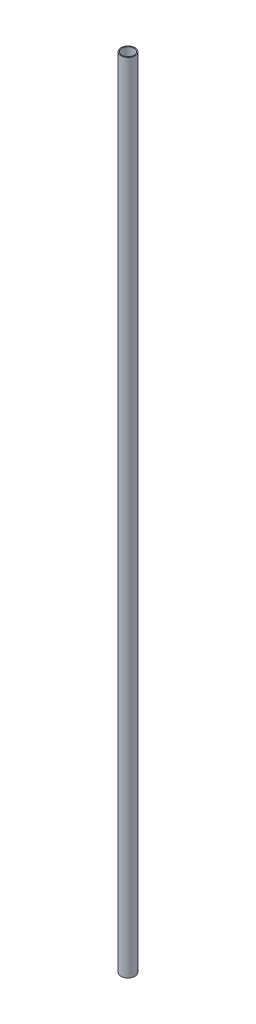
ISO-10303-21;
HEADER;
FILE_DESCRIPTION(('STEP AP214'),'2;1');
FILE_NAME('part.step','',(''),(''),'','','');
FILE_SCHEMA(('AUTOMOTIVE_DESIGN { 1 0 10303 214 1 1 1 1 }'));
ENDSEC;
DATA;
#1=APPLICATION_CONTEXT('core data for automotive mechanical design processes');
#2=APPLICATION_PROTOCOL_DEFINITION('international standard','automotive_design',2000,#1);
#3=PRODUCT_CONTEXT('',#1,'mechanical');
#4=PRODUCT('Part','Part','',(#3));
#5=PRODUCT_RELATED_PRODUCT_CATEGORY('part','',(#4));
#6=PRODUCT_DEFINITION_FORMATION('','',#4);
#7=PRODUCT_DEFINITION_CONTEXT('part definition',#1,'design');
#8=PRODUCT_DEFINITION('design','',#6,#7);
#9=PRODUCT_DEFINITION_SHAPE('','',#8);
#10=(LENGTH_UNIT() NAMED_UNIT(*) SI_UNIT(.MILLI.,.METRE.));
#11=(NAMED_UNIT(*) PLANE_ANGLE_UNIT() SI_UNIT($,.RADIAN.));
#12=(NAMED_UNIT(*) SI_UNIT($,.STERADIAN.) SOLID_ANGLE_UNIT());
#13=UNCERTAINTY_MEASURE_WITH_UNIT(LENGTH_MEASURE(1.E-05),#10,'distance_accuracy_value','');
#14=(GEOMETRIC_REPRESENTATION_CONTEXT(3) GLOBAL_UNCERTAINTY_ASSIGNED_CONTEXT((#13)) GLOBAL_UNIT_ASSIGNED_CONTEXT((#10,
#11,#12)) REPRESENTATION_CONTEXT('',''));
#15=CARTESIAN_POINT('',(0.,0.,0.));
#16=DIRECTION('',(0.,0.,1.));
#17=DIRECTION('',(1.,0.,0.));
#18=AXIS2_PLACEMENT_3D('',#15,#16,#17);
#19=CARTESIAN_POINT('',(0.,913.,0.));
#20=DIRECTION('',(0.,-1.,0.));
#21=DIRECTION('',(0.,0.,-1.));
#22=AXIS2_PLACEMENT_3D('',#19,#20,#21);
#23=CYLINDRICAL_SURFACE('',#22,7.);
#24=CARTESIAN_POINT('',(0.,913.,0.));
#25=DIRECTION('',(0.,1.,0.));
#26=DIRECTION('',(0.,0.,1.));
#27=AXIS2_PLACEMENT_3D('',#24,#25,#26);
#28=CIRCLE('',#27,7.);
#29=CARTESIAN_POINT('',(0.,913.,7.));
#30=VERTEX_POINT('',#29);
#31=EDGE_CURVE('E56',#30,#30,#28,.T.);
#32=ORIENTED_EDGE('',*,*,#31,.T.);
#33=EDGE_LOOP('',(#32));
#34=FACE_BOUND('',#33,.T.);
#35=CARTESIAN_POINT('',(0.,0.,0.));
#36=DIRECTION('',(0.,1.,0.));
#37=DIRECTION('',(0.,0.,1.));
#38=AXIS2_PLACEMENT_3D('',#35,#36,#37);
#39=CIRCLE('',#38,7.);
#40=CARTESIAN_POINT('',(0.,0.,7.));
#41=VERTEX_POINT('',#40);
#42=EDGE_CURVE('E62',#41,#41,#39,.T.);
#43=ORIENTED_EDGE('',*,*,#42,.F.);
#44=EDGE_LOOP('',(#43));
#45=FACE_BOUND('',#44,.T.);
#46=ADVANCED_FACE('F49',(#34,#45),#23,.F.);
#47=CARTESIAN_POINT('',(0.,913.,0.));
#48=DIRECTION('',(0.,-1.,0.));
#49=DIRECTION('',(0.,0.,-1.));
#50=AXIS2_PLACEMENT_3D('',#47,#48,#49);
#51=CYLINDRICAL_SURFACE('',#50,8.);
#52=CARTESIAN_POINT('',(0.,913.,0.));
#53=DIRECTION('',(0.,1.,0.));
#54=DIRECTION('',(0.,0.,1.));
#55=AXIS2_PLACEMENT_3D('',#52,#53,#54);
#56=CIRCLE('',#55,8.);
#57=CARTESIAN_POINT('',(0.,913.,8.));
#58=VERTEX_POINT('',#57);
#59=EDGE_CURVE('E10',#58,#58,#56,.T.);
#60=ORIENTED_EDGE('',*,*,#59,.F.);
#61=EDGE_LOOP('',(#60));
#62=FACE_BOUND('',#61,.T.);
#63=CARTESIAN_POINT('',(0.,0.,0.));
#64=DIRECTION('',(0.,1.,0.));
#65=DIRECTION('',(0.,0.,1.));
#66=AXIS2_PLACEMENT_3D('',#63,#64,#65);
#67=CIRCLE('',#66,8.);
#68=CARTESIAN_POINT('',(0.,0.,8.));
#69=VERTEX_POINT('',#68);
#70=EDGE_CURVE('E52',#69,#69,#67,.T.);
#71=ORIENTED_EDGE('',*,*,#70,.T.);
#72=EDGE_LOOP('',(#71));
#73=FACE_BOUND('',#72,.T.);
#74=ADVANCED_FACE('F69',(#62,#73),#51,.T.);
#75=CARTESIAN_POINT('',(0.,913.,0.));
#76=DIRECTION('',(0.,1.,0.));
#77=DIRECTION('',(0.,0.,1.));
#78=AXIS2_PLACEMENT_3D('',#75,#76,#77);
#79=PLANE('',#78);
#80=ORIENTED_EDGE('',*,*,#31,.F.);
#81=EDGE_LOOP('',(#80));
#82=FACE_BOUND('',#81,.T.);
#83=ORIENTED_EDGE('',*,*,#59,.T.);
#84=EDGE_LOOP('',(#83));
#85=FACE_BOUND('',#84,.T.);
#86=ADVANCED_FACE('F73',(#82,#85),#79,.T.);
#87=CARTESIAN_POINT('',(0.,0.,0.));
#88=DIRECTION('',(0.,1.,0.));
#89=DIRECTION('',(0.,0.,1.));
#90=AXIS2_PLACEMENT_3D('',#87,#88,#89);
#91=PLANE('',#90);
#92=ORIENTED_EDGE('',*,*,#42,.T.);
#93=EDGE_LOOP('',(#92));
#94=FACE_BOUND('',#93,.T.);
#95=ORIENTED_EDGE('',*,*,#70,.F.);
#96=EDGE_LOOP('',(#95));
#97=FACE_BOUND('',#96,.T.);
#98=ADVANCED_FACE('F71',(#94,#97),#91,.F.);
#99=CLOSED_SHELL('',(#46,#74,#86,#98));
#100=MANIFOLD_SOLID_BREP('B2',#99);
#101=ADVANCED_BREP_SHAPE_REPRESENTATION('',(#18,#100),#14);
#102=SHAPE_DEFINITION_REPRESENTATION(#9,#101);
ENDSEC;
END-ISO-10303-21;
